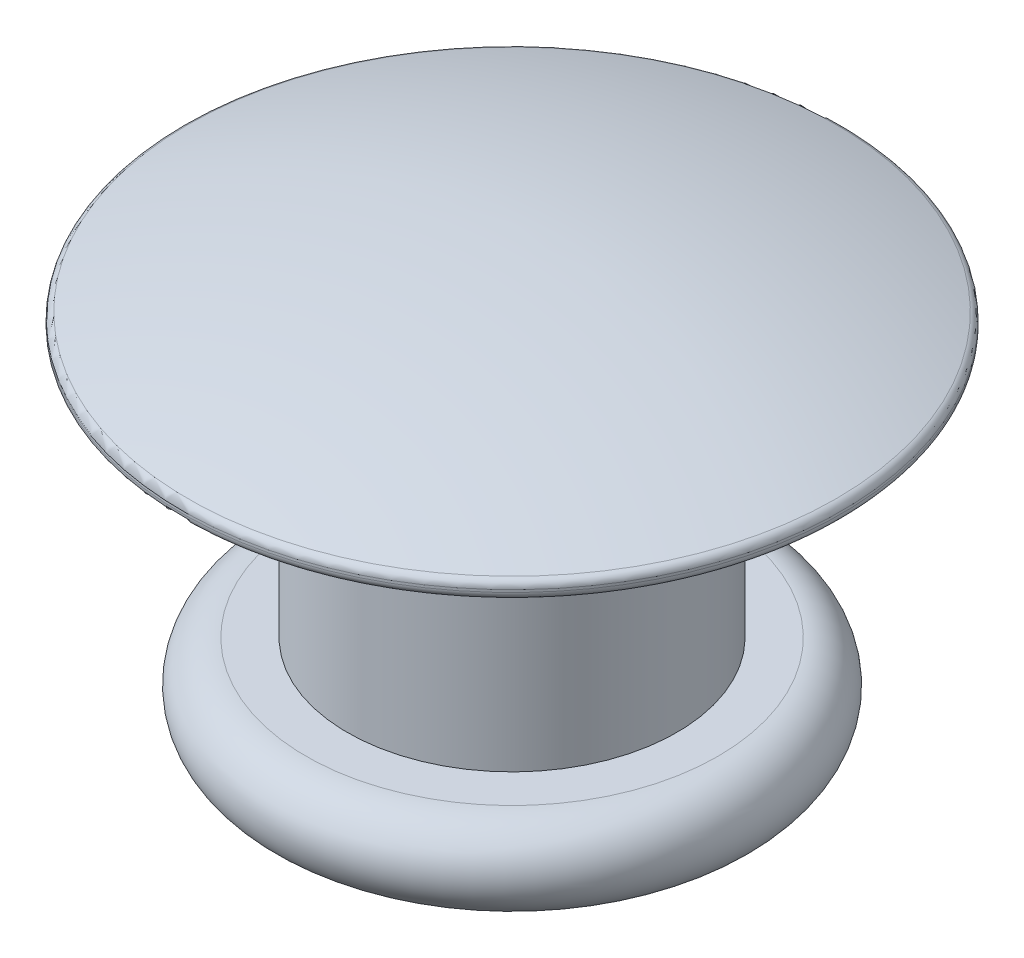
ISO-10303-21;
HEADER;
FILE_DESCRIPTION(('STEP AP214'),'2;1');
FILE_NAME('part.step','',(''),(''),'','','');
FILE_SCHEMA(('AUTOMOTIVE_DESIGN { 1 0 10303 214 1 1 1 1 }'));
ENDSEC;
DATA;
#1=APPLICATION_CONTEXT('core data for automotive mechanical design processes');
#2=APPLICATION_PROTOCOL_DEFINITION('international standard','automotive_design',2000,#1);
#3=PRODUCT_CONTEXT('',#1,'mechanical');
#4=PRODUCT('Part','Part','',(#3));
#5=PRODUCT_RELATED_PRODUCT_CATEGORY('part','',(#4));
#6=PRODUCT_DEFINITION_FORMATION('','',#4);
#7=PRODUCT_DEFINITION_CONTEXT('part definition',#1,'design');
#8=PRODUCT_DEFINITION('design','',#6,#7);
#9=PRODUCT_DEFINITION_SHAPE('','',#8);
#10=(LENGTH_UNIT() NAMED_UNIT(*) SI_UNIT(.MILLI.,.METRE.));
#11=(NAMED_UNIT(*) PLANE_ANGLE_UNIT() SI_UNIT($,.RADIAN.));
#12=(NAMED_UNIT(*) SI_UNIT($,.STERADIAN.) SOLID_ANGLE_UNIT());
#13=UNCERTAINTY_MEASURE_WITH_UNIT(LENGTH_MEASURE(1.E-05),#10,'distance_accuracy_value','');
#14=(GEOMETRIC_REPRESENTATION_CONTEXT(3) GLOBAL_UNCERTAINTY_ASSIGNED_CONTEXT((#13)) GLOBAL_UNIT_ASSIGNED_CONTEXT((#10,
#11,#12)) REPRESENTATION_CONTEXT('',''));
#15=CARTESIAN_POINT('',(0.,0.,0.));
#16=DIRECTION('',(0.,0.,1.));
#17=DIRECTION('',(1.,0.,0.));
#18=AXIS2_PLACEMENT_3D('',#15,#16,#17);
#19=CARTESIAN_POINT('',(1.4,-3.7,0.));
#20=DIRECTION('',(0.,1.,0.));
#21=DIRECTION('',(-1.,0.,0.));
#22=AXIS2_PLACEMENT_3D('',#19,#20,#21);
#23=PLANE('',#22);
#24=CARTESIAN_POINT('',(0.,-3.7,0.));
#25=DIRECTION('',(0.,1.,0.));
#26=DIRECTION('',(-1.,0.,0.));
#27=AXIS2_PLACEMENT_3D('',#24,#25,#26);
#28=CIRCLE('',#27,1.4);
#29=CARTESIAN_POINT('',(-1.4,-3.7,0.));
#30=VERTEX_POINT('',#29);
#31=EDGE_CURVE('E69',#30,#30,#28,.T.);
#32=ORIENTED_EDGE('',*,*,#31,.F.);
#33=EDGE_LOOP('',(#32));
#34=FACE_BOUND('',#33,.T.);
#35=ADVANCED_FACE('F17',(#34),#23,.F.);
#36=CARTESIAN_POINT('',(0.,-3.7,0.));
#37=DIRECTION('',(0.,1.,0.));
#38=DIRECTION('',(-1.,0.,0.));
#39=AXIS2_PLACEMENT_3D('',#36,#37,#38);
#40=TOROIDAL_SURFACE('',#39,1.9,0.499999999999999);
#41=CARTESIAN_POINT('',(0.,-4.2,0.));
#42=DIRECTION('',(0.,-1.,0.));
#43=DIRECTION('',(-1.,0.,0.));
#44=AXIS2_PLACEMENT_3D('',#41,#42,#43);
#45=CIRCLE('',#44,1.9);
#46=CARTESIAN_POINT('',(-1.9,-4.2,0.));
#47=VERTEX_POINT('',#46);
#48=CARTESIAN_POINT('',(1.9,-4.2,0.));
#49=VERTEX_POINT('',#48);
#50=EDGE_CURVE('E55',#47,#49,#45,.T.);
#51=ORIENTED_EDGE('',*,*,#50,.T.);
#52=CARTESIAN_POINT('',(0.,-4.2,0.));
#53=DIRECTION('',(0.,-1.,0.));
#54=DIRECTION('',(1.,0.,0.));
#55=AXIS2_PLACEMENT_3D('',#52,#53,#54);
#56=CIRCLE('',#55,1.9);
#57=EDGE_CURVE('E58',#49,#47,#56,.T.);
#58=ORIENTED_EDGE('',*,*,#57,.T.);
#59=EDGE_LOOP('',(#51,#58));
#60=FACE_BOUND('',#59,.T.);
#61=ORIENTED_EDGE('',*,*,#31,.T.);
#62=EDGE_LOOP('',(#61));
#63=FACE_BOUND('',#62,.T.);
#64=ADVANCED_FACE('F67',(#60,#63),#40,.T.);
#65=CARTESIAN_POINT('',(0.,-10.8785714285715,0.));
#66=DIRECTION('',(1.,0.,0.));
#67=DIRECTION('',(0.,-1.,0.));
#68=AXIS2_PLACEMENT_3D('',#65,#66,#67);
#69=SPHERICAL_SURFACE('',#68,11.7785714285715);
#70=CARTESIAN_POINT('',(0.,0.223822576390523,0.));
#71=DIRECTION('',(0.,1.,0.));
#72=DIRECTION('',(-1.,0.,0.));
#73=AXIS2_PLACEMENT_3D('',#70,#71,#72);
#74=CIRCLE('',#73,3.93339449541285);
#75=CARTESIAN_POINT('',(-3.93339449541285,0.223822576390522,0.));
#76=VERTEX_POINT('',#75);
#77=EDGE_CURVE('E64',#76,#76,#74,.F.);
#78=ORIENTED_EDGE('',*,*,#77,.F.);
#79=EDGE_LOOP('',(#78));
#80=FACE_BOUND('',#79,.T.);
#81=ADVANCED_FACE('F134',(#80),#69,.T.);
#82=CARTESIAN_POINT('',(2.5,-4.2,0.));
#83=DIRECTION('',(0.,1.,0.));
#84=DIRECTION('',(-1.,0.,0.));
#85=AXIS2_PLACEMENT_3D('',#82,#83,#84);
#86=PLANE('',#85);
#87=ORIENTED_EDGE('',*,*,#50,.F.);
#88=ORIENTED_EDGE('',*,*,#57,.F.);
#89=EDGE_LOOP('',(#87,#88));
#90=FACE_BOUND('',#89,.T.);
#91=CARTESIAN_POINT('',(0.,-4.2,0.));
#92=DIRECTION('',(0.,1.,0.));
#93=DIRECTION('',(1.,0.,0.));
#94=AXIS2_PLACEMENT_3D('',#91,#92,#93);
#95=CIRCLE('',#94,2.5);
#96=CARTESIAN_POINT('',(2.5,-4.2,0.));
#97=VERTEX_POINT('',#96);
#98=CARTESIAN_POINT('',(-2.5,-4.2,0.));
#99=VERTEX_POINT('',#98);
#100=EDGE_CURVE('E121',#97,#99,#95,.T.);
#101=ORIENTED_EDGE('',*,*,#100,.F.);
#102=CARTESIAN_POINT('',(0.,-4.2,0.));
#103=DIRECTION('',(0.,1.,0.));
#104=DIRECTION('',(-1.,0.,0.));
#105=AXIS2_PLACEMENT_3D('',#102,#103,#104);
#106=CIRCLE('',#105,2.5);
#107=EDGE_CURVE('E115',#99,#97,#106,.T.);
#108=ORIENTED_EDGE('',*,*,#107,.F.);
#109=EDGE_LOOP('',(#101,#108));
#110=FACE_BOUND('',#109,.T.);
#111=ADVANCED_FACE('F60',(#90,#110),#86,.F.);
#112=CARTESIAN_POINT('',(0.,0.129563318616439,0.));
#113=DIRECTION('',(0.,1.,0.));
#114=DIRECTION('',(-1.,0.,0.));
#115=AXIS2_PLACEMENT_3D('',#112,#113,#114);
#116=TOROIDAL_SURFACE('',#115,3.9,0.0999999999999994);
#117=ORIENTED_EDGE('',*,*,#77,.T.);
#118=EDGE_LOOP('',(#117));
#119=FACE_BOUND('',#118,.T.);
#120=CARTESIAN_POINT('',(0.,0.12956331861644,0.));
#121=DIRECTION('',(0.,1.,0.));
#122=DIRECTION('',(-1.,0.,0.));
#123=AXIS2_PLACEMENT_3D('',#120,#121,#122);
#124=CIRCLE('',#123,4.);
#125=CARTESIAN_POINT('',(-4.,0.12956331861644,0.));
#126=VERTEX_POINT('',#125);
#127=EDGE_CURVE('E107',#126,#126,#124,.F.);
#128=ORIENTED_EDGE('',*,*,#127,.F.);
#129=EDGE_LOOP('',(#128));
#130=FACE_BOUND('',#129,.T.);
#131=ADVANCED_FACE('F88',(#119,#130),#116,.T.);
#132=CARTESIAN_POINT('',(0.,-3.7,0.));
#133=DIRECTION('',(0.,1.,0.));
#134=DIRECTION('',(-1.,0.,0.));
#135=AXIS2_PLACEMENT_3D('',#132,#133,#134);
#136=TOROIDAL_SURFACE('',#135,2.5,0.5);
#137=CARTESIAN_POINT('',(0.,-3.2,0.));
#138=DIRECTION('',(0.,-1.,0.));
#139=DIRECTION('',(-1.,0.,0.));
#140=AXIS2_PLACEMENT_3D('',#137,#138,#139);
#141=CIRCLE('',#140,2.5);
#142=CARTESIAN_POINT('',(-2.5,-3.2,0.));
#143=VERTEX_POINT('',#142);
#144=CARTESIAN_POINT('',(2.5,-3.2,0.));
#145=VERTEX_POINT('',#144);
#146=EDGE_CURVE('E114',#143,#145,#141,.T.);
#147=ORIENTED_EDGE('',*,*,#146,.T.);
#148=CARTESIAN_POINT('',(0.,-3.2,0.));
#149=DIRECTION('',(0.,-1.,0.));
#150=DIRECTION('',(1.,0.,0.));
#151=AXIS2_PLACEMENT_3D('',#148,#149,#150);
#152=CIRCLE('',#151,2.5);
#153=EDGE_CURVE('E103',#145,#143,#152,.T.);
#154=ORIENTED_EDGE('',*,*,#153,.T.);
#155=EDGE_LOOP('',(#147,#154));
#156=FACE_BOUND('',#155,.T.);
#157=ORIENTED_EDGE('',*,*,#107,.T.);
#158=ORIENTED_EDGE('',*,*,#100,.T.);
#159=EDGE_LOOP('',(#157,#158));
#160=FACE_BOUND('',#159,.T.);
#161=ADVANCED_FACE('F76',(#156,#160),#136,.T.);
#162=CARTESIAN_POINT('',(0.,0.,0.));
#163=DIRECTION('',(0.,1.,0.));
#164=DIRECTION('',(-1.,0.,0.));
#165=AXIS2_PLACEMENT_3D('',#162,#163,#164);
#166=CYLINDRICAL_SURFACE('',#165,4.);
#167=ORIENTED_EDGE('',*,*,#127,.T.);
#168=EDGE_LOOP('',(#167));
#169=FACE_BOUND('',#168,.T.);
#170=CARTESIAN_POINT('',(0.,0.0999999999999939,0.));
#171=DIRECTION('',(0.,1.,0.));
#172=DIRECTION('',(-1.,0.,0.));
#173=AXIS2_PLACEMENT_3D('',#170,#171,#172);
#174=CIRCLE('',#173,4.);
#175=CARTESIAN_POINT('',(-4.,0.0999999999999934,0.));
#176=VERTEX_POINT('',#175);
#177=EDGE_CURVE('E99',#176,#176,#174,.F.);
#178=ORIENTED_EDGE('',*,*,#177,.F.);
#179=EDGE_LOOP('',(#178));
#180=FACE_BOUND('',#179,.T.);
#181=ADVANCED_FACE('F87',(#169,#180),#166,.T.);
#182=CARTESIAN_POINT('',(2.,-3.2,0.));
#183=DIRECTION('',(0.,-1.,0.));
#184=DIRECTION('',(1.,0.,0.));
#185=AXIS2_PLACEMENT_3D('',#182,#183,#184);
#186=PLANE('',#185);
#187=ORIENTED_EDGE('',*,*,#146,.F.);
#188=ORIENTED_EDGE('',*,*,#153,.F.);
#189=EDGE_LOOP('',(#187,#188));
#190=FACE_BOUND('',#189,.T.);
#191=CARTESIAN_POINT('',(0.,-3.2,0.));
#192=DIRECTION('',(0.,1.,0.));
#193=DIRECTION('',(-1.,0.,0.));
#194=AXIS2_PLACEMENT_3D('',#191,#192,#193);
#195=CIRCLE('',#194,2.);
#196=CARTESIAN_POINT('',(-2.,-3.2,0.));
#197=VERTEX_POINT('',#196);
#198=EDGE_CURVE('E185',#197,#197,#195,.T.);
#199=ORIENTED_EDGE('',*,*,#198,.F.);
#200=EDGE_LOOP('',(#199));
#201=FACE_BOUND('',#200,.T.);
#202=ADVANCED_FACE('F210',(#190,#201),#186,.F.);
#203=CARTESIAN_POINT('',(0.,0.0999999999999939,0.));
#204=DIRECTION('',(0.,1.,0.));
#205=DIRECTION('',(-1.,0.,0.));
#206=AXIS2_PLACEMENT_3D('',#203,#204,#205);
#207=TOROIDAL_SURFACE('',#206,3.9,0.1);
#208=ORIENTED_EDGE('',*,*,#177,.T.);
#209=EDGE_LOOP('',(#208));
#210=FACE_BOUND('',#209,.T.);
#211=CARTESIAN_POINT('',(0.,0.,0.));
#212=DIRECTION('',(0.,1.,0.));
#213=DIRECTION('',(-1.,0.,0.));
#214=AXIS2_PLACEMENT_3D('',#211,#212,#213);
#215=CIRCLE('',#214,3.9);
#216=CARTESIAN_POINT('',(-3.9,0.,0.));
#217=VERTEX_POINT('',#216);
#218=CARTESIAN_POINT('',(3.9,0.,0.));
#219=VERTEX_POINT('',#218);
#220=EDGE_CURVE('E27',#217,#219,#215,.T.);
#221=ORIENTED_EDGE('',*,*,#220,.T.);
#222=CARTESIAN_POINT('',(0.,0.,0.));
#223=DIRECTION('',(0.,1.,0.));
#224=DIRECTION('',(1.,0.,0.));
#225=AXIS2_PLACEMENT_3D('',#222,#223,#224);
#226=CIRCLE('',#225,3.9);
#227=EDGE_CURVE('E188',#219,#217,#226,.T.);
#228=ORIENTED_EDGE('',*,*,#227,.T.);
#229=EDGE_LOOP('',(#221,#228));
#230=FACE_BOUND('',#229,.T.);
#231=ADVANCED_FACE('F199',(#210,#230),#207,.T.);
#232=CARTESIAN_POINT('',(0.,0.,0.));
#233=DIRECTION('',(0.,1.,0.));
#234=DIRECTION('',(-1.,0.,0.));
#235=AXIS2_PLACEMENT_3D('',#232,#233,#234);
#236=CYLINDRICAL_SURFACE('',#235,2.);
#237=CARTESIAN_POINT('',(0.,0.,0.));
#238=DIRECTION('',(0.,1.,0.));
#239=DIRECTION('',(-1.,0.,0.));
#240=AXIS2_PLACEMENT_3D('',#237,#238,#239);
#241=CIRCLE('',#240,2.);
#242=CARTESIAN_POINT('',(-2.,0.,0.));
#243=VERTEX_POINT('',#242);
#244=EDGE_CURVE('E11',#243,#243,#241,.F.);
#245=ORIENTED_EDGE('',*,*,#244,.T.);
#246=EDGE_LOOP('',(#245));
#247=FACE_BOUND('',#246,.T.);
#248=ORIENTED_EDGE('',*,*,#198,.T.);
#249=EDGE_LOOP('',(#248));
#250=FACE_BOUND('',#249,.T.);
#251=ADVANCED_FACE('F209',(#247,#250),#236,.T.);
#252=CARTESIAN_POINT('',(3.9,0.,0.));
#253=DIRECTION('',(0.,1.,0.));
#254=DIRECTION('',(-1.,0.,0.));
#255=AXIS2_PLACEMENT_3D('',#252,#253,#254);
#256=PLANE('',#255);
#257=ORIENTED_EDGE('',*,*,#244,.F.);
#258=EDGE_LOOP('',(#257));
#259=FACE_BOUND('',#258,.T.);
#260=ORIENTED_EDGE('',*,*,#227,.F.);
#261=ORIENTED_EDGE('',*,*,#220,.F.);
#262=EDGE_LOOP('',(#260,#261));
#263=FACE_BOUND('',#262,.T.);
#264=ADVANCED_FACE('F256',(#259,#263),#256,.F.);
#265=CLOSED_SHELL('',(#35,#64,#81,#111,#131,#161,#181,#202,#231,#251,#264));
#266=MANIFOLD_SOLID_BREP('B1',#265);
#267=ADVANCED_BREP_SHAPE_REPRESENTATION('',(#18,#266),#14);
#268=SHAPE_DEFINITION_REPRESENTATION(#9,#267);
ENDSEC;
END-ISO-10303-21;
